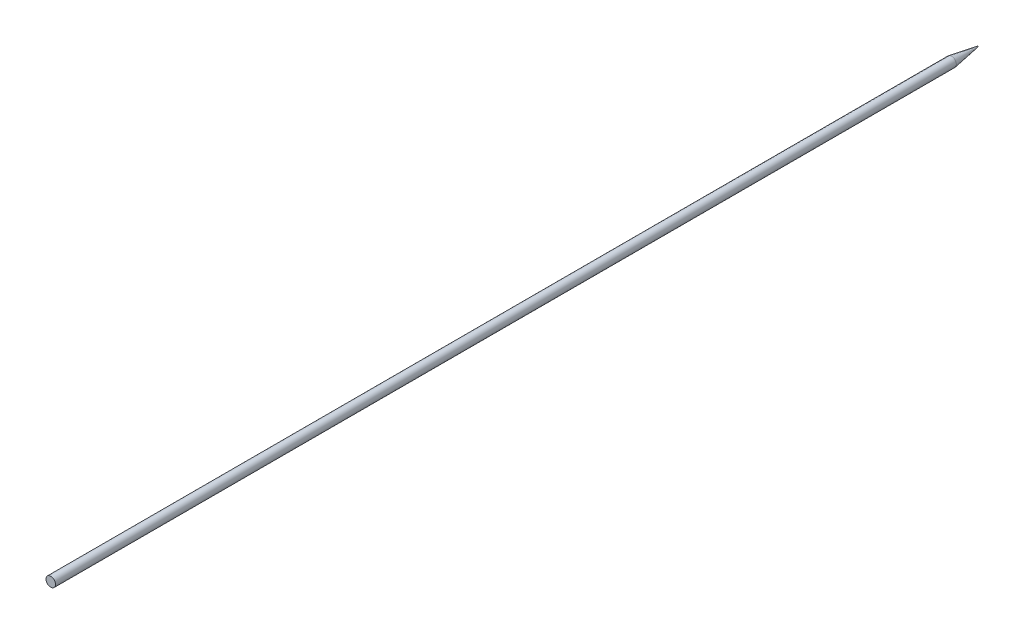
ISO-10303-21;
HEADER;
FILE_DESCRIPTION(('STEP AP214'),'2;1');
FILE_NAME('part.step','',(''),(''),'','','');
FILE_SCHEMA(('AUTOMOTIVE_DESIGN { 1 0 10303 214 1 1 1 1 }'));
ENDSEC;
DATA;
#1=APPLICATION_CONTEXT('core data for automotive mechanical design processes');
#2=APPLICATION_PROTOCOL_DEFINITION('international standard','automotive_design',2000,#1);
#3=PRODUCT_CONTEXT('',#1,'mechanical');
#4=PRODUCT('Part','Part','',(#3));
#5=PRODUCT_RELATED_PRODUCT_CATEGORY('part','',(#4));
#6=PRODUCT_DEFINITION_FORMATION('','',#4);
#7=PRODUCT_DEFINITION_CONTEXT('part definition',#1,'design');
#8=PRODUCT_DEFINITION('design','',#6,#7);
#9=PRODUCT_DEFINITION_SHAPE('','',#8);
#10=(LENGTH_UNIT() NAMED_UNIT(*) SI_UNIT(.MILLI.,.METRE.));
#11=(NAMED_UNIT(*) PLANE_ANGLE_UNIT() SI_UNIT($,.RADIAN.));
#12=(NAMED_UNIT(*) SI_UNIT($,.STERADIAN.) SOLID_ANGLE_UNIT());
#13=UNCERTAINTY_MEASURE_WITH_UNIT(LENGTH_MEASURE(1.E-05),#10,'distance_accuracy_value','');
#14=(GEOMETRIC_REPRESENTATION_CONTEXT(3) GLOBAL_UNCERTAINTY_ASSIGNED_CONTEXT((#13)) GLOBAL_UNIT_ASSIGNED_CONTEXT((#10,
#11,#12)) REPRESENTATION_CONTEXT('',''));
#15=CARTESIAN_POINT('',(0.,0.,0.));
#16=DIRECTION('',(0.,0.,1.));
#17=DIRECTION('',(1.,0.,0.));
#18=AXIS2_PLACEMENT_3D('',#15,#16,#17);
#19=CARTESIAN_POINT('',(0.,0.,189.470425857182));
#20=DIRECTION('',(0.,0.,1.));
#21=DIRECTION('',(1.,0.,0.));
#22=AXIS2_PLACEMENT_3D('',#19,#20,#21);
#23=PLANE('',#22);
#24=CARTESIAN_POINT('',(0.,0.,189.470425857182));
#25=DIRECTION('',(0.,0.,1.));
#26=DIRECTION('',(1.,0.,0.));
#27=AXIS2_PLACEMENT_3D('',#24,#25,#26);
#28=CIRCLE('',#27,0.999999999999936);
#29=CARTESIAN_POINT('',(0.999999999999936,0.,189.470425857182));
#30=VERTEX_POINT('',#29);
#31=EDGE_CURVE('E11',#30,#30,#28,.T.);
#32=ORIENTED_EDGE('',*,*,#31,.T.);
#33=EDGE_LOOP('',(#32));
#34=FACE_BOUND('',#33,.T.);
#35=ADVANCED_FACE('F34',(#34),#23,.T.);
#36=CARTESIAN_POINT('',(0.,0.,0.));
#37=DIRECTION('',(0.,0.,1.));
#38=DIRECTION('',(1.,0.,0.));
#39=AXIS2_PLACEMENT_3D('',#36,#37,#38);
#40=CYLINDRICAL_SURFACE('',#39,0.999999999999936);
#41=CARTESIAN_POINT('',(0.,0.,-3.57934621070082E-07));
#42=DIRECTION('',(0.,0.,1.));
#43=DIRECTION('',(1.,0.,0.));
#44=AXIS2_PLACEMENT_3D('',#41,#42,#43);
#45=CIRCLE('',#44,0.999999999999936);
#46=CARTESIAN_POINT('',(0.999999999999936,0.,-3.57934621070082E-07));
#47=VERTEX_POINT('',#46);
#48=EDGE_CURVE('E40',#47,#47,#45,.T.);
#49=ORIENTED_EDGE('',*,*,#48,.T.);
#50=EDGE_LOOP('',(#49));
#51=FACE_BOUND('',#50,.T.);
#52=ORIENTED_EDGE('',*,*,#31,.F.);
#53=EDGE_LOOP('',(#52));
#54=FACE_BOUND('',#53,.T.);
#55=ADVANCED_FACE('F63',(#51,#54),#40,.T.);
#56=CARTESIAN_POINT('',(0.,0.,-3.57934621070082E-07));
#57=DIRECTION('',(0.,0.,1.));
#58=DIRECTION('',(1.,0.,0.));
#59=AXIS2_PLACEMENT_3D('',#56,#57,#58);
#60=CONICAL_SURFACE('',#59,0.999999999999936,0.165148688129298);
#61=CARTESIAN_POINT('',(0.,0.,-5.44016812960745));
#62=DIRECTION('',(0.,0.,1.));
#63=DIRECTION('',(1.,0.,0.));
#64=AXIS2_PLACEMENT_3D('',#61,#62,#63);
#65=CIRCLE('',#64,0.0933053114790338);
#66=CARTESIAN_POINT('',(0.0933053114790339,0.,-5.44016812960745));
#67=VERTEX_POINT('',#66);
#68=EDGE_CURVE('E50',#67,#67,#65,.T.);
#69=CARTESIAN_POINT('',(0.0933053114790339,0.,-5.44016812960745));
#70=CARTESIAN_POINT('',(0.102750047817793,0.,-5.38349971531919));
#71=CARTESIAN_POINT('',(0.112194784156553,0.,-5.32683130103093));
#72=CARTESIAN_POINT('',(0.131084256834071,0.,-5.21349447245442));
#73=CARTESIAN_POINT('',(0.140528993172831,0.,-5.15682605816616));
#74=CARTESIAN_POINT('',(0.15941846585035,0.,-5.04348922958964));
#75=CARTESIAN_POINT('',(0.168863202189109,0.,-4.98682081530138));
#76=CARTESIAN_POINT('',(0.187752674866628,0.,-4.87348398672487));
#77=CARTESIAN_POINT('',(0.197197411205387,0.,-4.81681557243661));
#78=CARTESIAN_POINT('',(0.216086883882906,0.,-4.70347874386009));
#79=CARTESIAN_POINT('',(0.225531620221665,0.,-4.64681032957183));
#80=CARTESIAN_POINT('',(0.244421092899184,0.,-4.53347350099531));
#81=CARTESIAN_POINT('',(0.253865829237944,0.,-4.47680508670705));
#82=CARTESIAN_POINT('',(0.272755301915462,0.,-4.36346825813054));
#83=CARTESIAN_POINT('',(0.282200038254222,0.,-4.30679984384228));
#84=CARTESIAN_POINT('',(0.301089510931741,0.,-4.19346301526576));
#85=CARTESIAN_POINT('',(0.3105342472705,0.,-4.1367946009775));
#86=CARTESIAN_POINT('',(0.329423719948019,0.,-4.02345777240099));
#87=CARTESIAN_POINT('',(0.338868456286778,0.,-3.96678935811273));
#88=CARTESIAN_POINT('',(0.357757928964297,0.,-3.85345252953621));
#89=CARTESIAN_POINT('',(0.367202665303056,0.,-3.79678411524795));
#90=CARTESIAN_POINT('',(0.386092137980575,0.,-3.68344728667143));
#91=CARTESIAN_POINT('',(0.395536874319335,0.,-3.62677887238317));
#92=CARTESIAN_POINT('',(0.414426346996853,0.,-3.51344204380666));
#93=CARTESIAN_POINT('',(0.423871083335613,0.,-3.4567736295184));
#94=CARTESIAN_POINT('',(0.442760556013132,0.,-3.34343680094188));
#95=CARTESIAN_POINT('',(0.452205292351891,0.,-3.28676838665362));
#96=CARTESIAN_POINT('',(0.47109476502941,0.,-3.17343155807711));
#97=CARTESIAN_POINT('',(0.480539501368169,0.,-3.11676314378885));
#98=CARTESIAN_POINT('',(0.499428974045688,0.,-3.00342631521233));
#99=CARTESIAN_POINT('',(0.508873710384447,0.,-2.94675790092407));
#100=CARTESIAN_POINT('',(0.527763183061966,0.,-2.83342107234755));
#101=CARTESIAN_POINT('',(0.537207919400726,0.,-2.7767526580593));
#102=CARTESIAN_POINT('',(0.556097392078244,0.,-2.66341582948278));
#103=CARTESIAN_POINT('',(0.565542128417004,0.,-2.60674741519452));
#104=CARTESIAN_POINT('',(0.584431601094523,0.,-2.493410586618));
#105=CARTESIAN_POINT('',(0.593876337433282,0.,-2.43674217232974));
#106=CARTESIAN_POINT('',(0.612765810110801,0.,-2.32340534375323));
#107=CARTESIAN_POINT('',(0.62221054644956,0.,-2.26673692946497));
#108=CARTESIAN_POINT('',(0.641100019127079,0.,-2.15340010088845));
#109=CARTESIAN_POINT('',(0.650544755465839,0.,-2.09673168660019));
#110=CARTESIAN_POINT('',(0.669434228143357,0.,-1.98339485802367));
#111=CARTESIAN_POINT('',(0.678878964482116,0.,-1.92672644373542));
#112=CARTESIAN_POINT('',(0.697768437159635,0.,-1.8133896151589));
#113=CARTESIAN_POINT('',(0.707213173498395,0.,-1.75672120087064));
#114=CARTESIAN_POINT('',(0.726102646175914,0.,-1.64338437229412));
#115=CARTESIAN_POINT('',(0.735547382514673,0.,-1.58671595800586));
#116=CARTESIAN_POINT('',(0.754436855192192,0.,-1.47337912942935));
#117=CARTESIAN_POINT('',(0.763881591530951,0.,-1.41671071514109));
#118=CARTESIAN_POINT('',(0.78277106420847,0.,-1.30337388656457));
#119=CARTESIAN_POINT('',(0.79221580054723,0.,-1.24670547227631));
#120=CARTESIAN_POINT('',(0.811105273224748,0.,-1.13336864369979));
#121=CARTESIAN_POINT('',(0.820550009563508,0.,-1.07670022941154));
#122=CARTESIAN_POINT('',(0.839439482241026,0.,-0.963363400835019));
#123=CARTESIAN_POINT('',(0.848884218579786,0.,-0.90669498654676));
#124=CARTESIAN_POINT('',(0.867773691257305,0.,-0.793358157970242));
#125=CARTESIAN_POINT('',(0.877218427596064,0.,-0.736689743681984));
#126=CARTESIAN_POINT('',(0.896107900273583,0.,-0.623352915105466));
#127=CARTESIAN_POINT('',(0.905552636612342,0.,-0.566684500817208));
#128=CARTESIAN_POINT('',(0.924442109289861,0.,-0.45334767224069));
#129=CARTESIAN_POINT('',(0.93388684562862,0.,-0.396679257952432));
#130=CARTESIAN_POINT('',(0.952776318306139,0.,-0.283342429375914));
#131=CARTESIAN_POINT('',(0.962221054644899,0.,-0.226674015087656));
#132=CARTESIAN_POINT('',(0.981110527322417,0.,-0.113337186511138));
#133=CARTESIAN_POINT('',(0.990555263661177,0.,-0.0566687722228799));
#134=CARTESIAN_POINT('',(0.999999999999936,0.,-3.57934621070082E-07));
#135=B_SPLINE_CURVE_WITH_KNOTS('',3,(#69,#70,#71,#72,#73,#74,#75,#76,#77,#78,#79,#80,#81,#82,
#83,#84,#85,#86,#87,#88,#89,#90,#91,#92,#93,#94,#95,#96,#97,#98,#99,#100,#101,#102,#103,#104,
#105,#106,#107,#108,#109,#110,#111,#112,#113,#114,#115,#116,#117,#118,#119,#120,#121,#122,#123,
#124,#125,#126,#127,#128,#129,#130,#131,#132,#133,#134),.UNSPECIFIED.,.F.,.F.,(4,2,2,2,2,2,2,2,
2,2,2,2,2,2,2,2,2,2,2,2,2,2,2,2,2,2,2,2,2,2,2,2,4),(0.,0.172350253849797,0.344700507699595,
0.517050761549392,0.68940101539919,0.861751269248987,1.03410152309878,1.20645177694858,
1.37880203079838,1.55115228464818,1.72350253849797,1.89585279234777,2.06820304619757,
2.24055330004737,2.41290355389716,2.58525380774696,2.75760406159676,2.92995431544656,
3.10230456929635,3.27465482314615,3.44700507699595,3.61935533084575,3.79170558469554,
3.96405583854534,4.13640609239514,4.30875634624493,4.48110660009473,4.65345685394453,
4.82580710779433,4.99815736164412,5.17050761549392,5.34285786934372,5.51520812319352),.UNSPECIFIED.);
#136=EDGE_CURVE('BSEAM46',#67,#47,#135,.T.);
#137=ORIENTED_EDGE('',*,*,#68,.T.);
#138=ORIENTED_EDGE('',*,*,#48,.F.);
#139=ORIENTED_EDGE('',*,*,#136,.T.);
#140=ORIENTED_EDGE('',*,*,#136,.F.);
#141=EDGE_LOOP('',(#137,#139,#138,#140));
#142=FACE_BOUND('',#141,.T.);
#143=ADVANCED_FACE('F46',(#142),#60,.T.);
#144=CARTESIAN_POINT('',(0.0933053114790338,0.,-5.44016812960745));
#145=CARTESIAN_POINT('',(0.0721884621943778,0.,-5.52651662708407));
#146=CARTESIAN_POINT('',(0.,0.,-5.52957414281816));
#147=B_SPLINE_CURVE_WITH_KNOTS('',2,(#144,#145,#146),.UNSPECIFIED.,.F.,.F.,(3,3),(0.,1.),.UNSPECIFIED.);
#148=CARTESIAN_POINT('',(0.,0.,0.));
#149=DIRECTION('',(0.,0.,1.));
#150=AXIS1_PLACEMENT('',#148,#149);
#151=SURFACE_OF_REVOLUTION('',#147,#150);
#152=CARTESIAN_POINT('',(0.,0.,-5.52957414281816));
#153=VERTEX_POINT('',#152);
#154=VERTEX_LOOP('',#153);
#155=FACE_BOUND('',#154,.T.);
#156=ORIENTED_EDGE('',*,*,#68,.F.);
#157=EDGE_LOOP('',(#156));
#158=FACE_BOUND('',#157,.T.);
#159=ADVANCED_FACE('F43',(#155,#158),#151,.F.);
#160=CLOSED_SHELL('',(#35,#55,#143,#159));
#161=MANIFOLD_SOLID_BREP('B2',#160);
#162=ADVANCED_BREP_SHAPE_REPRESENTATION('',(#18,#161),#14);
#163=SHAPE_DEFINITION_REPRESENTATION(#9,#162);
ENDSEC;
END-ISO-10303-21;
